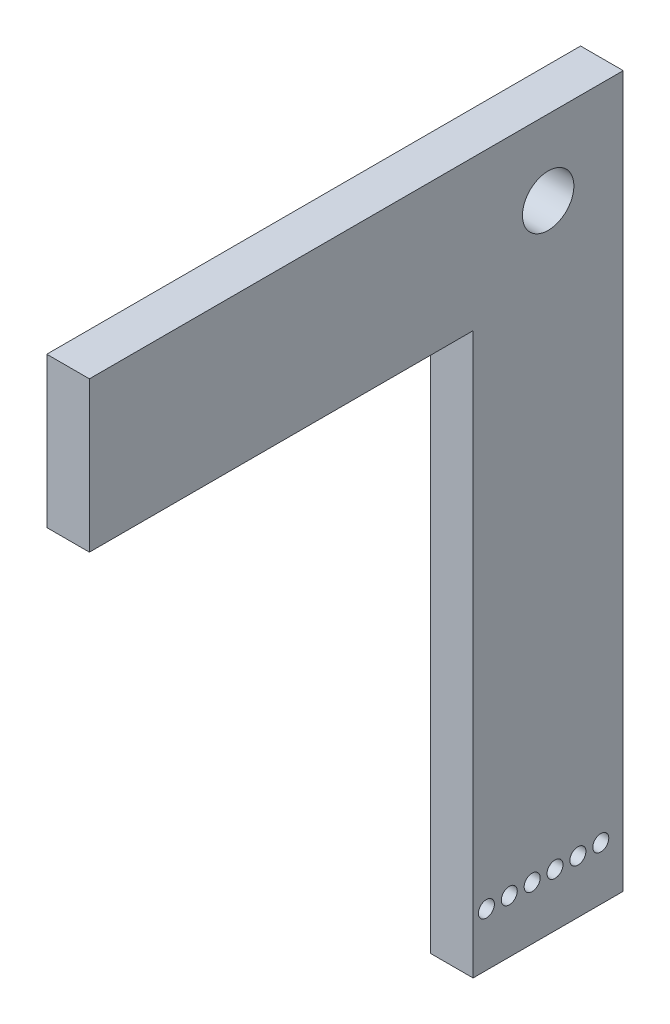
ISO-10303-21;
HEADER;
FILE_DESCRIPTION(('STEP AP214'),'2;1');
FILE_NAME('part.step','',(''),(''),'','','');
FILE_SCHEMA(('AUTOMOTIVE_DESIGN { 1 0 10303 214 1 1 1 1 }'));
ENDSEC;
DATA;
#1=APPLICATION_CONTEXT('core data for automotive mechanical design processes');
#2=APPLICATION_PROTOCOL_DEFINITION('international standard','automotive_design',2000,#1);
#3=PRODUCT_CONTEXT('',#1,'mechanical');
#4=PRODUCT('Part','Part','',(#3));
#5=PRODUCT_RELATED_PRODUCT_CATEGORY('part','',(#4));
#6=PRODUCT_DEFINITION_FORMATION('','',#4);
#7=PRODUCT_DEFINITION_CONTEXT('part definition',#1,'design');
#8=PRODUCT_DEFINITION('design','',#6,#7);
#9=PRODUCT_DEFINITION_SHAPE('','',#8);
#10=(LENGTH_UNIT() NAMED_UNIT(*) SI_UNIT(.MILLI.,.METRE.));
#11=(NAMED_UNIT(*) PLANE_ANGLE_UNIT() SI_UNIT($,.RADIAN.));
#12=(NAMED_UNIT(*) SI_UNIT($,.STERADIAN.) SOLID_ANGLE_UNIT());
#13=UNCERTAINTY_MEASURE_WITH_UNIT(LENGTH_MEASURE(1.E-05),#10,'distance_accuracy_value','');
#14=(GEOMETRIC_REPRESENTATION_CONTEXT(3) GLOBAL_UNCERTAINTY_ASSIGNED_CONTEXT((#13)) GLOBAL_UNIT_ASSIGNED_CONTEXT((#10,
#11,#12)) REPRESENTATION_CONTEXT('',''));
#15=CARTESIAN_POINT('',(0.,0.,0.));
#16=DIRECTION('',(0.,0.,1.));
#17=DIRECTION('',(1.,0.,0.));
#18=AXIS2_PLACEMENT_3D('',#15,#16,#17);
#19=CARTESIAN_POINT('',(2.,0.,0.));
#20=DIRECTION('',(-1.,0.,0.));
#21=DIRECTION('',(0.,0.,1.));
#22=AXIS2_PLACEMENT_3D('',#19,#20,#21);
#23=PLANE('',#22);
#24=DIRECTION('',(0.,1.,0.));
#25=VECTOR('',#24,1.);
#26=CARTESIAN_POINT('',(2.,7.04192561507143,-7.04192561507145));
#27=LINE('',#26,#25);
#28=CARTESIAN_POINT('',(2.,-59.627321197738,-7.04192561507142));
#29=VERTEX_POINT('',#28);
#30=CARTESIAN_POINT('',(2.,7.04192561507143,-7.04192561507145));
#31=VERTEX_POINT('',#30);
#32=EDGE_CURVE('E131',#29,#31,#27,.T.);
#33=ORIENTED_EDGE('',*,*,#32,.T.);
#34=DIRECTION('',(0.,0.,1.));
#35=VECTOR('',#34,1.);
#36=CARTESIAN_POINT('',(2.,7.04192561507142,43.0321508881553));
#37=LINE('',#36,#35);
#38=CARTESIAN_POINT('',(2.,7.04192561507142,43.0321508881553));
#39=VERTEX_POINT('',#38);
#40=EDGE_CURVE('E89',#31,#39,#37,.T.);
#41=ORIENTED_EDGE('',*,*,#40,.T.);
#42=DIRECTION('',(0.,-1.,0.));
#43=VECTOR('',#42,1.);
#44=CARTESIAN_POINT('',(2.,-7.04192561507142,43.0321508881553));
#45=LINE('',#44,#43);
#46=CARTESIAN_POINT('',(2.,-7.04192561507142,43.0321508881553));
#47=VERTEX_POINT('',#46);
#48=EDGE_CURVE('E102',#39,#47,#45,.T.);
#49=ORIENTED_EDGE('',*,*,#48,.T.);
#50=DIRECTION('',(0.,0.,-1.));
#51=VECTOR('',#50,1.);
#52=CARTESIAN_POINT('',(2.,-7.04192561507146,7.04192561507142));
#53=LINE('',#52,#51);
#54=CARTESIAN_POINT('',(2.,-7.04192561507146,7.04192561507142));
#55=VERTEX_POINT('',#54);
#56=EDGE_CURVE('E96',#47,#55,#53,.T.);
#57=ORIENTED_EDGE('',*,*,#56,.T.);
#58=DIRECTION('',(0.,-1.,0.));
#59=VECTOR('',#58,1.);
#60=CARTESIAN_POINT('',(2.,-59.627321197738,7.04192561507142));
#61=LINE('',#60,#59);
#62=CARTESIAN_POINT('',(2.,-59.627321197738,7.04192561507142));
#63=VERTEX_POINT('',#62);
#64=EDGE_CURVE('E100',#55,#63,#61,.T.);
#65=ORIENTED_EDGE('',*,*,#64,.T.);
#66=DIRECTION('',(0.,0.,-1.));
#67=VECTOR('',#66,1.);
#68=CARTESIAN_POINT('',(2.,-59.627321197738,-7.04192561507142));
#69=LINE('',#68,#67);
#70=EDGE_CURVE('E52',#63,#29,#69,.T.);
#71=ORIENTED_EDGE('',*,*,#70,.T.);
#72=EDGE_LOOP('',(#33,#41,#49,#57,#65,#71));
#73=FACE_BOUND('',#72,.T.);
#74=CARTESIAN_POINT('',(2.,0.,0.));
#75=DIRECTION('',(1.,0.,0.));
#76=DIRECTION('',(0.,0.,-1.));
#77=AXIS2_PLACEMENT_3D('',#74,#75,#76);
#78=CIRCLE('',#77,2.413);
#79=CARTESIAN_POINT('',(2.,0.,-2.413));
#80=VERTEX_POINT('',#79);
#81=EDGE_CURVE('E124',#80,#80,#78,.T.);
#82=ORIENTED_EDGE('',*,*,#81,.F.);
#83=EDGE_LOOP('',(#82));
#84=FACE_BOUND('',#83,.T.);
#85=CARTESIAN_POINT('',(2.,-54.627321197738,5.79192561507142));
#86=DIRECTION('',(1.,0.,0.));
#87=DIRECTION('',(0.,0.,-1.));
#88=AXIS2_PLACEMENT_3D('',#85,#86,#87);
#89=CIRCLE('',#88,0.750000000000001);
#90=CARTESIAN_POINT('',(2.,-54.627321197738,5.04192561507142));
#91=VERTEX_POINT('',#90);
#92=EDGE_CURVE('E225',#91,#91,#89,.T.);
#93=ORIENTED_EDGE('',*,*,#92,.F.);
#94=EDGE_LOOP('',(#93));
#95=FACE_BOUND('',#94,.T.);
#96=CARTESIAN_POINT('',(2.,-54.627321197738,3.64647106961687));
#97=DIRECTION('',(1.,0.,0.));
#98=DIRECTION('',(0.,0.,-1.));
#99=AXIS2_PLACEMENT_3D('',#96,#97,#98);
#100=CIRCLE('',#99,0.750000000000001);
#101=CARTESIAN_POINT('',(2.,-54.627321197738,2.89647106961687));
#102=VERTEX_POINT('',#101);
#103=EDGE_CURVE('E219',#102,#102,#100,.T.);
#104=ORIENTED_EDGE('',*,*,#103,.F.);
#105=EDGE_LOOP('',(#104));
#106=FACE_BOUND('',#105,.T.);
#107=CARTESIAN_POINT('',(2.,-54.627321197738,1.50101652416233));
#108=DIRECTION('',(1.,0.,0.));
#109=DIRECTION('',(0.,0.,-1.));
#110=AXIS2_PLACEMENT_3D('',#107,#108,#109);
#111=CIRCLE('',#110,0.750000000000001);
#112=CARTESIAN_POINT('',(2.,-54.627321197738,0.751016524162328));
#113=VERTEX_POINT('',#112);
#114=EDGE_CURVE('E213',#113,#113,#111,.T.);
#115=ORIENTED_EDGE('',*,*,#114,.F.);
#116=EDGE_LOOP('',(#115));
#117=FACE_BOUND('',#116,.T.);
#118=CARTESIAN_POINT('',(2.,-54.627321197738,-0.644438021292216));
#119=DIRECTION('',(1.,0.,0.));
#120=DIRECTION('',(0.,0.,-1.));
#121=AXIS2_PLACEMENT_3D('',#118,#119,#120);
#122=CIRCLE('',#121,0.750000000000001);
#123=CARTESIAN_POINT('',(2.,-54.627321197738,-1.39443802129222));
#124=VERTEX_POINT('',#123);
#125=EDGE_CURVE('E207',#124,#124,#122,.T.);
#126=ORIENTED_EDGE('',*,*,#125,.F.);
#127=EDGE_LOOP('',(#126));
#128=FACE_BOUND('',#127,.T.);
#129=CARTESIAN_POINT('',(2.,-54.627321197738,-2.78989256674676));
#130=DIRECTION('',(1.,0.,0.));
#131=DIRECTION('',(0.,0.,-1.));
#132=AXIS2_PLACEMENT_3D('',#129,#130,#131);
#133=CIRCLE('',#132,0.750000000000001);
#134=CARTESIAN_POINT('',(2.,-54.627321197738,-3.53989256674676));
#135=VERTEX_POINT('',#134);
#136=EDGE_CURVE('E201',#135,#135,#133,.T.);
#137=ORIENTED_EDGE('',*,*,#136,.F.);
#138=EDGE_LOOP('',(#137));
#139=FACE_BOUND('',#138,.T.);
#140=CARTESIAN_POINT('',(2.,-54.627321197738,-4.93534711220131));
#141=DIRECTION('',(1.,0.,0.));
#142=DIRECTION('',(0.,0.,-1.));
#143=AXIS2_PLACEMENT_3D('',#140,#141,#142);
#144=CIRCLE('',#143,0.750000000000001);
#145=CARTESIAN_POINT('',(2.,-54.627321197738,-5.68534711220131));
#146=VERTEX_POINT('',#145);
#147=EDGE_CURVE('E192',#146,#146,#144,.T.);
#148=ORIENTED_EDGE('',*,*,#147,.F.);
#149=EDGE_LOOP('',(#148));
#150=FACE_BOUND('',#149,.T.);
#151=ADVANCED_FACE('F35',(#73,#84,#95,#106,#117,#128,#139,#150),#23,.F.);
#152=CARTESIAN_POINT('',(-2.,0.,0.));
#153=DIRECTION('',(-1.,0.,0.));
#154=DIRECTION('',(0.,0.,1.));
#155=AXIS2_PLACEMENT_3D('',#152,#153,#154);
#156=PLANE('',#155);
#157=CARTESIAN_POINT('',(-2.,-54.627321197738,-2.78989256674676));
#158=DIRECTION('',(1.,0.,0.));
#159=DIRECTION('',(0.,0.,-1.));
#160=AXIS2_PLACEMENT_3D('',#157,#158,#159);
#161=CIRCLE('',#160,0.750000000000001);
#162=CARTESIAN_POINT('',(-2.,-54.627321197738,-3.53989256674676));
#163=VERTEX_POINT('',#162);
#164=EDGE_CURVE('E198',#163,#163,#161,.T.);
#165=ORIENTED_EDGE('',*,*,#164,.T.);
#166=EDGE_LOOP('',(#165));
#167=FACE_BOUND('',#166,.T.);
#168=CARTESIAN_POINT('',(-2.,-54.627321197738,1.50101652416233));
#169=DIRECTION('',(1.,0.,0.));
#170=DIRECTION('',(0.,0.,-1.));
#171=AXIS2_PLACEMENT_3D('',#168,#169,#170);
#172=CIRCLE('',#171,0.750000000000001);
#173=CARTESIAN_POINT('',(-2.,-54.627321197738,0.751016524162328));
#174=VERTEX_POINT('',#173);
#175=EDGE_CURVE('E210',#174,#174,#172,.T.);
#176=ORIENTED_EDGE('',*,*,#175,.T.);
#177=EDGE_LOOP('',(#176));
#178=FACE_BOUND('',#177,.T.);
#179=CARTESIAN_POINT('',(-2.,-54.627321197738,5.79192561507142));
#180=DIRECTION('',(1.,0.,0.));
#181=DIRECTION('',(0.,0.,-1.));
#182=AXIS2_PLACEMENT_3D('',#179,#180,#181);
#183=CIRCLE('',#182,0.750000000000001);
#184=CARTESIAN_POINT('',(-2.,-54.627321197738,5.04192561507142));
#185=VERTEX_POINT('',#184);
#186=EDGE_CURVE('E222',#185,#185,#183,.T.);
#187=ORIENTED_EDGE('',*,*,#186,.T.);
#188=EDGE_LOOP('',(#187));
#189=FACE_BOUND('',#188,.T.);
#190=DIRECTION('',(0.,1.,0.));
#191=VECTOR('',#190,1.);
#192=CARTESIAN_POINT('',(-2.,7.04192561507143,-7.04192561507145));
#193=LINE('',#192,#191);
#194=CARTESIAN_POINT('',(-2.,-59.627321197738,-7.04192561507142));
#195=VERTEX_POINT('',#194);
#196=CARTESIAN_POINT('',(-2.,7.04192561507143,-7.04192561507145));
#197=VERTEX_POINT('',#196);
#198=EDGE_CURVE('E120',#195,#197,#193,.T.);
#199=ORIENTED_EDGE('',*,*,#198,.F.);
#200=DIRECTION('',(0.,0.,-1.));
#201=VECTOR('',#200,1.);
#202=CARTESIAN_POINT('',(-2.,-59.627321197738,-7.04192561507142));
#203=LINE('',#202,#201);
#204=CARTESIAN_POINT('',(-2.,-59.627321197738,7.04192561507142));
#205=VERTEX_POINT('',#204);
#206=EDGE_CURVE('E81',#205,#195,#203,.T.);
#207=ORIENTED_EDGE('',*,*,#206,.F.);
#208=DIRECTION('',(0.,-1.,0.));
#209=VECTOR('',#208,1.);
#210=CARTESIAN_POINT('',(-2.,-59.627321197738,7.04192561507142));
#211=LINE('',#210,#209);
#212=CARTESIAN_POINT('',(-2.,-7.04192561507146,7.04192561507142));
#213=VERTEX_POINT('',#212);
#214=EDGE_CURVE('E75',#213,#205,#211,.T.);
#215=ORIENTED_EDGE('',*,*,#214,.F.);
#216=DIRECTION('',(0.,0.,-1.));
#217=VECTOR('',#216,1.);
#218=CARTESIAN_POINT('',(-2.,-7.04192561507146,7.04192561507142));
#219=LINE('',#218,#217);
#220=CARTESIAN_POINT('',(-2.,-7.04192561507142,43.0321508881553));
#221=VERTEX_POINT('',#220);
#222=EDGE_CURVE('E110',#221,#213,#219,.T.);
#223=ORIENTED_EDGE('',*,*,#222,.F.);
#224=DIRECTION('',(0.,-1.,0.));
#225=VECTOR('',#224,1.);
#226=CARTESIAN_POINT('',(-2.,-7.04192561507142,43.0321508881553));
#227=LINE('',#226,#225);
#228=CARTESIAN_POINT('',(-2.,7.04192561507142,43.0321508881553));
#229=VERTEX_POINT('',#228);
#230=EDGE_CURVE('E126',#229,#221,#227,.T.);
#231=ORIENTED_EDGE('',*,*,#230,.F.);
#232=DIRECTION('',(0.,0.,1.));
#233=VECTOR('',#232,1.);
#234=CARTESIAN_POINT('',(-2.,7.04192561507142,43.0321508881553));
#235=LINE('',#234,#233);
#236=EDGE_CURVE('E123',#197,#229,#235,.T.);
#237=ORIENTED_EDGE('',*,*,#236,.F.);
#238=EDGE_LOOP('',(#199,#207,#215,#223,#231,#237));
#239=FACE_BOUND('',#238,.T.);
#240=CARTESIAN_POINT('',(-2.,0.,0.));
#241=DIRECTION('',(1.,0.,0.));
#242=DIRECTION('',(0.,0.,-1.));
#243=AXIS2_PLACEMENT_3D('',#240,#241,#242);
#244=CIRCLE('',#243,2.413);
#245=CARTESIAN_POINT('',(-2.,0.,-2.413));
#246=VERTEX_POINT('',#245);
#247=EDGE_CURVE('E228',#246,#246,#244,.T.);
#248=ORIENTED_EDGE('',*,*,#247,.T.);
#249=EDGE_LOOP('',(#248));
#250=FACE_BOUND('',#249,.T.);
#251=CARTESIAN_POINT('',(-2.,-54.627321197738,3.64647106961687));
#252=DIRECTION('',(1.,0.,0.));
#253=DIRECTION('',(0.,0.,-1.));
#254=AXIS2_PLACEMENT_3D('',#251,#252,#253);
#255=CIRCLE('',#254,0.750000000000001);
#256=CARTESIAN_POINT('',(-2.,-54.627321197738,2.89647106961687));
#257=VERTEX_POINT('',#256);
#258=EDGE_CURVE('E216',#257,#257,#255,.T.);
#259=ORIENTED_EDGE('',*,*,#258,.T.);
#260=EDGE_LOOP('',(#259));
#261=FACE_BOUND('',#260,.T.);
#262=CARTESIAN_POINT('',(-2.,-54.627321197738,-0.644438021292216));
#263=DIRECTION('',(1.,0.,0.));
#264=DIRECTION('',(0.,0.,-1.));
#265=AXIS2_PLACEMENT_3D('',#262,#263,#264);
#266=CIRCLE('',#265,0.750000000000001);
#267=CARTESIAN_POINT('',(-2.,-54.627321197738,-1.39443802129222));
#268=VERTEX_POINT('',#267);
#269=EDGE_CURVE('E204',#268,#268,#266,.T.);
#270=ORIENTED_EDGE('',*,*,#269,.T.);
#271=EDGE_LOOP('',(#270));
#272=FACE_BOUND('',#271,.T.);
#273=CARTESIAN_POINT('',(-2.,-54.627321197738,-4.93534711220131));
#274=DIRECTION('',(1.,0.,0.));
#275=DIRECTION('',(0.,0.,-1.));
#276=AXIS2_PLACEMENT_3D('',#273,#274,#275);
#277=CIRCLE('',#276,0.750000000000001);
#278=CARTESIAN_POINT('',(-2.,-54.627321197738,-5.68534711220131));
#279=VERTEX_POINT('',#278);
#280=EDGE_CURVE('E195',#279,#279,#277,.T.);
#281=ORIENTED_EDGE('',*,*,#280,.T.);
#282=EDGE_LOOP('',(#281));
#283=FACE_BOUND('',#282,.T.);
#284=ADVANCED_FACE('F140',(#167,#178,#189,#239,#250,#261,#272,#283),#156,.T.);
#285=CARTESIAN_POINT('',(2.,7.04192561507143,-7.04192561507145));
#286=DIRECTION('',(0.,0.,1.));
#287=DIRECTION('',(0.,-1.,0.));
#288=AXIS2_PLACEMENT_3D('',#285,#286,#287);
#289=PLANE('',#288);
#290=ORIENTED_EDGE('',*,*,#198,.T.);
#291=DIRECTION('',(-1.,0.,0.));
#292=VECTOR('',#291,1.);
#293=CARTESIAN_POINT('',(2.,7.04192561507143,-7.04192561507145));
#294=LINE('',#293,#292);
#295=EDGE_CURVE('E11',#31,#197,#294,.T.);
#296=ORIENTED_EDGE('',*,*,#295,.F.);
#297=ORIENTED_EDGE('',*,*,#32,.F.);
#298=DIRECTION('',(-1.,0.,0.));
#299=VECTOR('',#298,1.);
#300=CARTESIAN_POINT('',(2.,-59.627321197738,-7.04192561507142));
#301=LINE('',#300,#299);
#302=EDGE_CURVE('E116',#29,#195,#301,.T.);
#303=ORIENTED_EDGE('',*,*,#302,.T.);
#304=EDGE_LOOP('',(#290,#296,#297,#303));
#305=FACE_BOUND('',#304,.T.);
#306=ADVANCED_FACE('F37',(#305),#289,.F.);
#307=CARTESIAN_POINT('',(2.,7.04192561507142,43.0321508881553));
#308=DIRECTION('',(0.,-1.,0.));
#309=DIRECTION('',(0.,0.,-1.));
#310=AXIS2_PLACEMENT_3D('',#307,#308,#309);
#311=PLANE('',#310);
#312=ORIENTED_EDGE('',*,*,#236,.T.);
#313=DIRECTION('',(-1.,0.,0.));
#314=VECTOR('',#313,1.);
#315=CARTESIAN_POINT('',(2.,7.04192561507142,43.0321508881553));
#316=LINE('',#315,#314);
#317=EDGE_CURVE('E44',#39,#229,#316,.T.);
#318=ORIENTED_EDGE('',*,*,#317,.F.);
#319=ORIENTED_EDGE('',*,*,#40,.F.);
#320=ORIENTED_EDGE('',*,*,#295,.T.);
#321=EDGE_LOOP('',(#312,#318,#319,#320));
#322=FACE_BOUND('',#321,.T.);
#323=ADVANCED_FACE('F315',(#322),#311,.F.);
#324=CARTESIAN_POINT('',(2.,-7.04192561507142,43.0321508881553));
#325=DIRECTION('',(0.,0.,-1.));
#326=DIRECTION('',(-1.,0.,0.));
#327=AXIS2_PLACEMENT_3D('',#324,#325,#326);
#328=PLANE('',#327);
#329=ORIENTED_EDGE('',*,*,#230,.T.);
#330=DIRECTION('',(-1.,0.,0.));
#331=VECTOR('',#330,1.);
#332=CARTESIAN_POINT('',(2.,-7.04192561507142,43.0321508881553));
#333=LINE('',#332,#331);
#334=EDGE_CURVE('E111',#47,#221,#333,.T.);
#335=ORIENTED_EDGE('',*,*,#334,.F.);
#336=ORIENTED_EDGE('',*,*,#48,.F.);
#337=ORIENTED_EDGE('',*,*,#317,.T.);
#338=EDGE_LOOP('',(#329,#335,#336,#337));
#339=FACE_BOUND('',#338,.T.);
#340=ADVANCED_FACE('F137',(#339),#328,.F.);
#341=CARTESIAN_POINT('',(2.,-7.04192561507146,7.04192561507142));
#342=DIRECTION('',(0.,1.,0.));
#343=DIRECTION('',(0.,0.,1.));
#344=AXIS2_PLACEMENT_3D('',#341,#342,#343);
#345=PLANE('',#344);
#346=ORIENTED_EDGE('',*,*,#222,.T.);
#347=DIRECTION('',(-1.,0.,0.));
#348=VECTOR('',#347,1.);
#349=CARTESIAN_POINT('',(2.,-7.04192561507146,7.04192561507142));
#350=LINE('',#349,#348);
#351=EDGE_CURVE('E107',#55,#213,#350,.T.);
#352=ORIENTED_EDGE('',*,*,#351,.F.);
#353=ORIENTED_EDGE('',*,*,#56,.F.);
#354=ORIENTED_EDGE('',*,*,#334,.T.);
#355=EDGE_LOOP('',(#346,#352,#353,#354));
#356=FACE_BOUND('',#355,.T.);
#357=ADVANCED_FACE('F108',(#356),#345,.F.);
#358=CARTESIAN_POINT('',(2.,-59.627321197738,7.04192561507142));
#359=DIRECTION('',(0.,0.,-1.));
#360=DIRECTION('',(0.,1.,0.));
#361=AXIS2_PLACEMENT_3D('',#358,#359,#360);
#362=PLANE('',#361);
#363=ORIENTED_EDGE('',*,*,#214,.T.);
#364=DIRECTION('',(-1.,0.,0.));
#365=VECTOR('',#364,1.);
#366=CARTESIAN_POINT('',(2.,-59.627321197738,7.04192561507142));
#367=LINE('',#366,#365);
#368=EDGE_CURVE('E112',#63,#205,#367,.T.);
#369=ORIENTED_EDGE('',*,*,#368,.F.);
#370=ORIENTED_EDGE('',*,*,#64,.F.);
#371=ORIENTED_EDGE('',*,*,#351,.T.);
#372=EDGE_LOOP('',(#363,#369,#370,#371));
#373=FACE_BOUND('',#372,.T.);
#374=ADVANCED_FACE('F114',(#373),#362,.F.);
#375=CARTESIAN_POINT('',(2.,-59.627321197738,-7.04192561507142));
#376=DIRECTION('',(0.,1.,0.));
#377=DIRECTION('',(0.,0.,1.));
#378=AXIS2_PLACEMENT_3D('',#375,#376,#377);
#379=PLANE('',#378);
#380=ORIENTED_EDGE('',*,*,#206,.T.);
#381=ORIENTED_EDGE('',*,*,#302,.F.);
#382=ORIENTED_EDGE('',*,*,#70,.F.);
#383=ORIENTED_EDGE('',*,*,#368,.T.);
#384=EDGE_LOOP('',(#380,#381,#382,#383));
#385=FACE_BOUND('',#384,.T.);
#386=ADVANCED_FACE('F145',(#385),#379,.F.);
#387=CARTESIAN_POINT('',(2.,0.,0.));
#388=DIRECTION('',(-1.,0.,0.));
#389=DIRECTION('',(0.,0.,1.));
#390=AXIS2_PLACEMENT_3D('',#387,#388,#389);
#391=CYLINDRICAL_SURFACE('',#390,2.413);
#392=ORIENTED_EDGE('',*,*,#81,.T.);
#393=EDGE_LOOP('',(#392));
#394=FACE_BOUND('',#393,.T.);
#395=ORIENTED_EDGE('',*,*,#247,.F.);
#396=EDGE_LOOP('',(#395));
#397=FACE_BOUND('',#396,.T.);
#398=ADVANCED_FACE('F147',(#394,#397),#391,.F.);
#399=CARTESIAN_POINT('',(2.,-54.627321197738,5.79192561507142));
#400=DIRECTION('',(-1.,0.,0.));
#401=DIRECTION('',(0.,0.,1.));
#402=AXIS2_PLACEMENT_3D('',#399,#400,#401);
#403=CYLINDRICAL_SURFACE('',#402,0.750000000000001);
#404=ORIENTED_EDGE('',*,*,#92,.T.);
#405=EDGE_LOOP('',(#404));
#406=FACE_BOUND('',#405,.T.);
#407=ORIENTED_EDGE('',*,*,#186,.F.);
#408=EDGE_LOOP('',(#407));
#409=FACE_BOUND('',#408,.T.);
#410=ADVANCED_FACE('F153',(#406,#409),#403,.F.);
#411=CARTESIAN_POINT('',(2.,-54.627321197738,3.64647106961687));
#412=DIRECTION('',(-1.,0.,0.));
#413=DIRECTION('',(0.,0.,1.));
#414=AXIS2_PLACEMENT_3D('',#411,#412,#413);
#415=CYLINDRICAL_SURFACE('',#414,0.750000000000001);
#416=ORIENTED_EDGE('',*,*,#103,.T.);
#417=EDGE_LOOP('',(#416));
#418=FACE_BOUND('',#417,.T.);
#419=ORIENTED_EDGE('',*,*,#258,.F.);
#420=EDGE_LOOP('',(#419));
#421=FACE_BOUND('',#420,.T.);
#422=ADVANCED_FACE('F167',(#418,#421),#415,.F.);
#423=CARTESIAN_POINT('',(2.,-54.627321197738,1.50101652416233));
#424=DIRECTION('',(-1.,0.,0.));
#425=DIRECTION('',(0.,0.,1.));
#426=AXIS2_PLACEMENT_3D('',#423,#424,#425);
#427=CYLINDRICAL_SURFACE('',#426,0.750000000000001);
#428=ORIENTED_EDGE('',*,*,#114,.T.);
#429=EDGE_LOOP('',(#428));
#430=FACE_BOUND('',#429,.T.);
#431=ORIENTED_EDGE('',*,*,#175,.F.);
#432=EDGE_LOOP('',(#431));
#433=FACE_BOUND('',#432,.T.);
#434=ADVANCED_FACE('F171',(#430,#433),#427,.F.);
#435=CARTESIAN_POINT('',(2.,-54.627321197738,-0.644438021292216));
#436=DIRECTION('',(-1.,0.,0.));
#437=DIRECTION('',(0.,0.,1.));
#438=AXIS2_PLACEMENT_3D('',#435,#436,#437);
#439=CYLINDRICAL_SURFACE('',#438,0.750000000000001);
#440=ORIENTED_EDGE('',*,*,#125,.T.);
#441=EDGE_LOOP('',(#440));
#442=FACE_BOUND('',#441,.T.);
#443=ORIENTED_EDGE('',*,*,#269,.F.);
#444=EDGE_LOOP('',(#443));
#445=FACE_BOUND('',#444,.T.);
#446=ADVANCED_FACE('F175',(#442,#445),#439,.F.);
#447=CARTESIAN_POINT('',(2.,-54.627321197738,-2.78989256674676));
#448=DIRECTION('',(-1.,0.,0.));
#449=DIRECTION('',(0.,0.,1.));
#450=AXIS2_PLACEMENT_3D('',#447,#448,#449);
#451=CYLINDRICAL_SURFACE('',#450,0.750000000000001);
#452=ORIENTED_EDGE('',*,*,#136,.T.);
#453=EDGE_LOOP('',(#452));
#454=FACE_BOUND('',#453,.T.);
#455=ORIENTED_EDGE('',*,*,#164,.F.);
#456=EDGE_LOOP('',(#455));
#457=FACE_BOUND('',#456,.T.);
#458=ADVANCED_FACE('F179',(#454,#457),#451,.F.);
#459=CARTESIAN_POINT('',(2.,-54.627321197738,-4.93534711220131));
#460=DIRECTION('',(-1.,0.,0.));
#461=DIRECTION('',(0.,0.,1.));
#462=AXIS2_PLACEMENT_3D('',#459,#460,#461);
#463=CYLINDRICAL_SURFACE('',#462,0.750000000000001);
#464=ORIENTED_EDGE('',*,*,#147,.T.);
#465=EDGE_LOOP('',(#464));
#466=FACE_BOUND('',#465,.T.);
#467=ORIENTED_EDGE('',*,*,#280,.F.);
#468=EDGE_LOOP('',(#467));
#469=FACE_BOUND('',#468,.T.);
#470=ADVANCED_FACE('F183',(#466,#469),#463,.F.);
#471=CLOSED_SHELL('',(#151,#284,#306,#323,#340,#357,#374,#386,#398,#410,#422,#434,#446,#458,#470));
#472=MANIFOLD_SOLID_BREP('B2',#471);
#473=ADVANCED_BREP_SHAPE_REPRESENTATION('',(#18,#472),#14);
#474=SHAPE_DEFINITION_REPRESENTATION(#9,#473);
ENDSEC;
END-ISO-10303-21;
